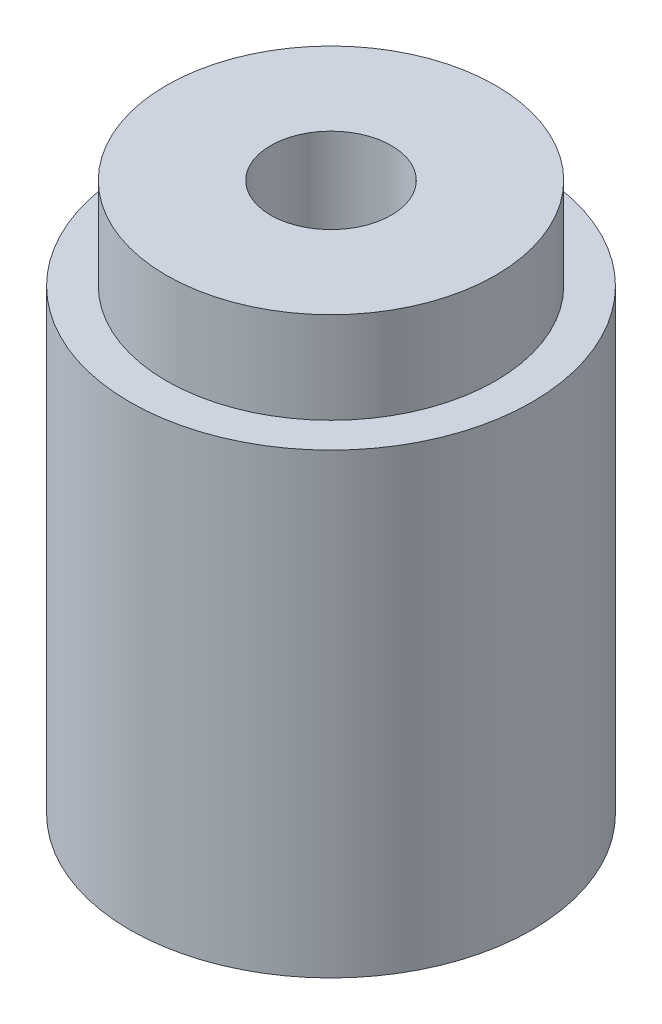
ISO-10303-21;
HEADER;
FILE_DESCRIPTION(('STEP AP214'),'2;1');
FILE_NAME('part.step','',(''),(''),'','','');
FILE_SCHEMA(('AUTOMOTIVE_DESIGN { 1 0 10303 214 1 1 1 1 }'));
ENDSEC;
DATA;
#1=APPLICATION_CONTEXT('core data for automotive mechanical design processes');
#2=APPLICATION_PROTOCOL_DEFINITION('international standard','automotive_design',2000,#1);
#3=PRODUCT_CONTEXT('',#1,'mechanical');
#4=PRODUCT('Part','Part','',(#3));
#5=PRODUCT_RELATED_PRODUCT_CATEGORY('part','',(#4));
#6=PRODUCT_DEFINITION_FORMATION('','',#4);
#7=PRODUCT_DEFINITION_CONTEXT('part definition',#1,'design');
#8=PRODUCT_DEFINITION('design','',#6,#7);
#9=PRODUCT_DEFINITION_SHAPE('','',#8);
#10=(LENGTH_UNIT() NAMED_UNIT(*) SI_UNIT(.MILLI.,.METRE.));
#11=(NAMED_UNIT(*) PLANE_ANGLE_UNIT() SI_UNIT($,.RADIAN.));
#12=(NAMED_UNIT(*) SI_UNIT($,.STERADIAN.) SOLID_ANGLE_UNIT());
#13=UNCERTAINTY_MEASURE_WITH_UNIT(LENGTH_MEASURE(1.E-05),#10,'distance_accuracy_value','');
#14=(GEOMETRIC_REPRESENTATION_CONTEXT(3) GLOBAL_UNCERTAINTY_ASSIGNED_CONTEXT((#13)) GLOBAL_UNIT_ASSIGNED_CONTEXT((#10,
#11,#12)) REPRESENTATION_CONTEXT('',''));
#15=CARTESIAN_POINT('',(0.,0.,0.));
#16=DIRECTION('',(0.,0.,1.));
#17=DIRECTION('',(1.,0.,0.));
#18=AXIS2_PLACEMENT_3D('',#15,#16,#17);
#19=CARTESIAN_POINT('',(0.,18.8279166910181,0.));
#20=DIRECTION('',(0.,1.,0.));
#21=DIRECTION('',(0.,0.,1.));
#22=AXIS2_PLACEMENT_3D('',#19,#20,#21);
#23=CYLINDRICAL_SURFACE('',#22,3.3);
#24=CARTESIAN_POINT('',(0.,23.,0.));
#25=DIRECTION('',(0.,1.,0.));
#26=DIRECTION('',(0.,0.,1.));
#27=AXIS2_PLACEMENT_3D('',#24,#25,#26);
#28=CIRCLE('',#27,3.3);
#29=CARTESIAN_POINT('',(0.,23.,3.3));
#30=VERTEX_POINT('',#29);
#31=EDGE_CURVE('E68',#30,#30,#28,.T.);
#32=ORIENTED_EDGE('',*,*,#31,.F.);
#33=EDGE_LOOP('',(#32));
#34=FACE_BOUND('',#33,.T.);
#35=CARTESIAN_POINT('',(0.,30.,0.));
#36=DIRECTION('',(0.,1.,0.));
#37=DIRECTION('',(0.,0.,1.));
#38=AXIS2_PLACEMENT_3D('',#35,#36,#37);
#39=CIRCLE('',#38,3.3);
#40=CARTESIAN_POINT('',(0.,30.,3.3));
#41=VERTEX_POINT('',#40);
#42=EDGE_CURVE('E10',#41,#41,#39,.T.);
#43=ORIENTED_EDGE('',*,*,#42,.T.);
#44=EDGE_LOOP('',(#43));
#45=FACE_BOUND('',#44,.T.);
#46=ADVANCED_FACE('F40',(#34,#45),#23,.F.);
#47=CARTESIAN_POINT('',(3.3,30.,0.));
#48=DIRECTION('',(0.,-1.,0.));
#49=DIRECTION('',(0.,0.,-1.));
#50=AXIS2_PLACEMENT_3D('',#47,#48,#49);
#51=PLANE('',#50);
#52=ORIENTED_EDGE('',*,*,#42,.F.);
#53=EDGE_LOOP('',(#52));
#54=FACE_BOUND('',#53,.T.);
#55=CARTESIAN_POINT('',(0.,30.,0.));
#56=DIRECTION('',(0.,1.,0.));
#57=DIRECTION('',(0.,0.,1.));
#58=AXIS2_PLACEMENT_3D('',#55,#56,#57);
#59=CIRCLE('',#58,9.);
#60=CARTESIAN_POINT('',(0.,30.,9.));
#61=VERTEX_POINT('',#60);
#62=EDGE_CURVE('E46',#61,#61,#59,.T.);
#63=ORIENTED_EDGE('',*,*,#62,.T.);
#64=EDGE_LOOP('',(#63));
#65=FACE_BOUND('',#64,.T.);
#66=ADVANCED_FACE('F75',(#54,#65),#51,.F.);
#67=CARTESIAN_POINT('',(0.,18.8279166910181,0.));
#68=DIRECTION('',(0.,1.,0.));
#69=DIRECTION('',(0.,0.,1.));
#70=AXIS2_PLACEMENT_3D('',#67,#68,#69);
#71=CYLINDRICAL_SURFACE('',#70,9.);
#72=ORIENTED_EDGE('',*,*,#62,.F.);
#73=EDGE_LOOP('',(#72));
#74=FACE_BOUND('',#73,.T.);
#75=CARTESIAN_POINT('',(0.,25.,0.));
#76=DIRECTION('',(0.,1.,0.));
#77=DIRECTION('',(0.,0.,1.));
#78=AXIS2_PLACEMENT_3D('',#75,#76,#77);
#79=CIRCLE('',#78,9.);
#80=CARTESIAN_POINT('',(0.,25.,9.));
#81=VERTEX_POINT('',#80);
#82=EDGE_CURVE('E50',#81,#81,#79,.T.);
#83=ORIENTED_EDGE('',*,*,#82,.T.);
#84=EDGE_LOOP('',(#83));
#85=FACE_BOUND('',#84,.T.);
#86=ADVANCED_FACE('F79',(#74,#85),#71,.T.);
#87=CARTESIAN_POINT('',(9.,25.,0.));
#88=DIRECTION('',(0.,-1.,0.));
#89=DIRECTION('',(0.,0.,-1.));
#90=AXIS2_PLACEMENT_3D('',#87,#88,#89);
#91=PLANE('',#90);
#92=ORIENTED_EDGE('',*,*,#82,.F.);
#93=EDGE_LOOP('',(#92));
#94=FACE_BOUND('',#93,.T.);
#95=CARTESIAN_POINT('',(0.,25.,0.));
#96=DIRECTION('',(0.,1.,0.));
#97=DIRECTION('',(0.,0.,1.));
#98=AXIS2_PLACEMENT_3D('',#95,#96,#97);
#99=CIRCLE('',#98,11.);
#100=CARTESIAN_POINT('',(0.,25.,11.));
#101=VERTEX_POINT('',#100);
#102=EDGE_CURVE('E54',#101,#101,#99,.T.);
#103=ORIENTED_EDGE('',*,*,#102,.T.);
#104=EDGE_LOOP('',(#103));
#105=FACE_BOUND('',#104,.T.);
#106=ADVANCED_FACE('F84',(#94,#105),#91,.F.);
#107=CARTESIAN_POINT('',(0.,18.8279166910181,0.));
#108=DIRECTION('',(0.,1.,0.));
#109=DIRECTION('',(0.,0.,1.));
#110=AXIS2_PLACEMENT_3D('',#107,#108,#109);
#111=CYLINDRICAL_SURFACE('',#110,11.);
#112=ORIENTED_EDGE('',*,*,#102,.F.);
#113=EDGE_LOOP('',(#112));
#114=FACE_BOUND('',#113,.T.);
#115=CARTESIAN_POINT('',(0.,0.,0.));
#116=DIRECTION('',(0.,1.,0.));
#117=DIRECTION('',(0.,0.,1.));
#118=AXIS2_PLACEMENT_3D('',#115,#116,#117);
#119=CIRCLE('',#118,11.);
#120=CARTESIAN_POINT('',(0.,0.,11.));
#121=VERTEX_POINT('',#120);
#122=EDGE_CURVE('E59',#121,#121,#119,.T.);
#123=ORIENTED_EDGE('',*,*,#122,.T.);
#124=EDGE_LOOP('',(#123));
#125=FACE_BOUND('',#124,.T.);
#126=ADVANCED_FACE('F90',(#114,#125),#111,.T.);
#127=CARTESIAN_POINT('',(11.,0.,0.));
#128=DIRECTION('',(0.,1.,0.));
#129=DIRECTION('',(0.,0.,1.));
#130=AXIS2_PLACEMENT_3D('',#127,#128,#129);
#131=PLANE('',#130);
#132=ORIENTED_EDGE('',*,*,#122,.F.);
#133=EDGE_LOOP('',(#132));
#134=FACE_BOUND('',#133,.T.);
#135=CARTESIAN_POINT('',(0.,0.,0.));
#136=DIRECTION('',(0.,1.,0.));
#137=DIRECTION('',(0.,0.,1.));
#138=AXIS2_PLACEMENT_3D('',#135,#136,#137);
#139=CIRCLE('',#138,8.);
#140=CARTESIAN_POINT('',(0.,0.,8.));
#141=VERTEX_POINT('',#140);
#142=EDGE_CURVE('E62',#141,#141,#139,.T.);
#143=ORIENTED_EDGE('',*,*,#142,.T.);
#144=EDGE_LOOP('',(#143));
#145=FACE_BOUND('',#144,.T.);
#146=ADVANCED_FACE('F94',(#134,#145),#131,.F.);
#147=CARTESIAN_POINT('',(0.,18.8279166910181,0.));
#148=DIRECTION('',(0.,1.,0.));
#149=DIRECTION('',(0.,0.,1.));
#150=AXIS2_PLACEMENT_3D('',#147,#148,#149);
#151=CYLINDRICAL_SURFACE('',#150,8.);
#152=ORIENTED_EDGE('',*,*,#142,.F.);
#153=EDGE_LOOP('',(#152));
#154=FACE_BOUND('',#153,.T.);
#155=CARTESIAN_POINT('',(0.,23.,0.));
#156=DIRECTION('',(0.,1.,0.));
#157=DIRECTION('',(0.,0.,1.));
#158=AXIS2_PLACEMENT_3D('',#155,#156,#157);
#159=CIRCLE('',#158,8.);
#160=CARTESIAN_POINT('',(0.,23.,8.));
#161=VERTEX_POINT('',#160);
#162=EDGE_CURVE('E65',#161,#161,#159,.T.);
#163=ORIENTED_EDGE('',*,*,#162,.T.);
#164=EDGE_LOOP('',(#163));
#165=FACE_BOUND('',#164,.T.);
#166=ADVANCED_FACE('F98',(#154,#165),#151,.F.);
#167=CARTESIAN_POINT('',(8.,23.,0.));
#168=DIRECTION('',(0.,1.,0.));
#169=DIRECTION('',(0.,0.,1.));
#170=AXIS2_PLACEMENT_3D('',#167,#168,#169);
#171=PLANE('',#170);
#172=ORIENTED_EDGE('',*,*,#162,.F.);
#173=EDGE_LOOP('',(#172));
#174=FACE_BOUND('',#173,.T.);
#175=ORIENTED_EDGE('',*,*,#31,.T.);
#176=EDGE_LOOP('',(#175));
#177=FACE_BOUND('',#176,.T.);
#178=ADVANCED_FACE('F72',(#174,#177),#171,.F.);
#179=CLOSED_SHELL('',(#46,#66,#86,#106,#126,#146,#166,#178));
#180=MANIFOLD_SOLID_BREP('B2',#179);
#181=ADVANCED_BREP_SHAPE_REPRESENTATION('',(#18,#180),#14);
#182=SHAPE_DEFINITION_REPRESENTATION(#9,#181);
ENDSEC;
END-ISO-10303-21;
